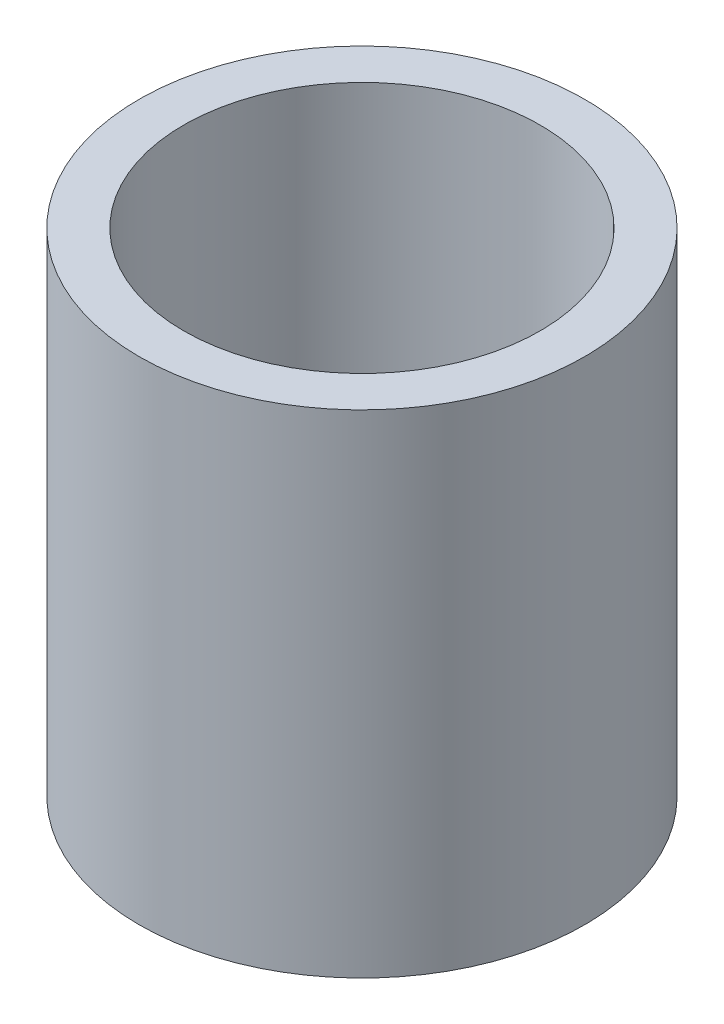
ISO-10303-21;
HEADER;
FILE_DESCRIPTION(('STEP AP214'),'2;1');
FILE_NAME('part.step','',(''),(''),'','','');
FILE_SCHEMA(('AUTOMOTIVE_DESIGN { 1 0 10303 214 1 1 1 1 }'));
ENDSEC;
DATA;
#1=APPLICATION_CONTEXT('core data for automotive mechanical design processes');
#2=APPLICATION_PROTOCOL_DEFINITION('international standard','automotive_design',2000,#1);
#3=PRODUCT_CONTEXT('',#1,'mechanical');
#4=PRODUCT('Part','Part','',(#3));
#5=PRODUCT_RELATED_PRODUCT_CATEGORY('part','',(#4));
#6=PRODUCT_DEFINITION_FORMATION('','',#4);
#7=PRODUCT_DEFINITION_CONTEXT('part definition',#1,'design');
#8=PRODUCT_DEFINITION('design','',#6,#7);
#9=PRODUCT_DEFINITION_SHAPE('','',#8);
#10=(LENGTH_UNIT() NAMED_UNIT(*) SI_UNIT(.MILLI.,.METRE.));
#11=(NAMED_UNIT(*) PLANE_ANGLE_UNIT() SI_UNIT($,.RADIAN.));
#12=(NAMED_UNIT(*) SI_UNIT($,.STERADIAN.) SOLID_ANGLE_UNIT());
#13=UNCERTAINTY_MEASURE_WITH_UNIT(LENGTH_MEASURE(1.E-05),#10,'distance_accuracy_value','');
#14=(GEOMETRIC_REPRESENTATION_CONTEXT(3) GLOBAL_UNCERTAINTY_ASSIGNED_CONTEXT((#13)) GLOBAL_UNIT_ASSIGNED_CONTEXT((#10,
#11,#12)) REPRESENTATION_CONTEXT('',''));
#15=CARTESIAN_POINT('',(0.,0.,0.));
#16=DIRECTION('',(0.,0.,1.));
#17=DIRECTION('',(1.,0.,0.));
#18=AXIS2_PLACEMENT_3D('',#15,#16,#17);
#19=CARTESIAN_POINT('',(0.,0.69,0.));
#20=DIRECTION('',(0.,1.,0.));
#21=DIRECTION('',(0.,0.,1.));
#22=AXIS2_PLACEMENT_3D('',#19,#20,#21);
#23=PLANE('',#22);
#24=CARTESIAN_POINT('',(0.,0.69,0.));
#25=DIRECTION('',(0.,1.,0.));
#26=DIRECTION('',(0.,0.,1.));
#27=AXIS2_PLACEMENT_3D('',#24,#25,#26);
#28=CIRCLE('',#27,0.625);
#29=CARTESIAN_POINT('',(0.,0.69,0.625));
#30=VERTEX_POINT('',#29);
#31=EDGE_CURVE('E10',#30,#30,#28,.T.);
#32=ORIENTED_EDGE('',*,*,#31,.T.);
#33=EDGE_LOOP('',(#32));
#34=FACE_BOUND('',#33,.T.);
#35=CARTESIAN_POINT('',(0.,0.69,0.));
#36=DIRECTION('',(0.,1.,0.));
#37=DIRECTION('',(0.,0.,1.));
#38=AXIS2_PLACEMENT_3D('',#35,#36,#37);
#39=CIRCLE('',#38,0.5);
#40=CARTESIAN_POINT('',(0.,0.69,0.5));
#41=VERTEX_POINT('',#40);
#42=EDGE_CURVE('E46',#41,#41,#39,.T.);
#43=ORIENTED_EDGE('',*,*,#42,.F.);
#44=EDGE_LOOP('',(#43));
#45=FACE_BOUND('',#44,.T.);
#46=ADVANCED_FACE('F35',(#34,#45),#23,.T.);
#47=CARTESIAN_POINT('',(0.,-0.69,0.));
#48=DIRECTION('',(0.,1.,0.));
#49=DIRECTION('',(0.,0.,1.));
#50=AXIS2_PLACEMENT_3D('',#47,#48,#49);
#51=PLANE('',#50);
#52=CARTESIAN_POINT('',(0.,-0.69,0.));
#53=DIRECTION('',(0.,1.,0.));
#54=DIRECTION('',(0.,0.,1.));
#55=AXIS2_PLACEMENT_3D('',#52,#53,#54);
#56=CIRCLE('',#55,0.625);
#57=CARTESIAN_POINT('',(0.,-0.69,0.625));
#58=VERTEX_POINT('',#57);
#59=EDGE_CURVE('E39',#58,#58,#56,.T.);
#60=ORIENTED_EDGE('',*,*,#59,.F.);
#61=EDGE_LOOP('',(#60));
#62=FACE_BOUND('',#61,.T.);
#63=CARTESIAN_POINT('',(0.,-0.69,0.));
#64=DIRECTION('',(0.,1.,0.));
#65=DIRECTION('',(0.,0.,1.));
#66=AXIS2_PLACEMENT_3D('',#63,#64,#65);
#67=CIRCLE('',#66,0.5);
#68=CARTESIAN_POINT('',(0.,-0.69,0.5));
#69=VERTEX_POINT('',#68);
#70=EDGE_CURVE('E48',#69,#69,#67,.T.);
#71=ORIENTED_EDGE('',*,*,#70,.T.);
#72=EDGE_LOOP('',(#71));
#73=FACE_BOUND('',#72,.T.);
#74=ADVANCED_FACE('F58',(#62,#73),#51,.F.);
#75=CARTESIAN_POINT('',(0.,0.69,0.));
#76=DIRECTION('',(0.,-1.,0.));
#77=DIRECTION('',(0.,0.,-1.));
#78=AXIS2_PLACEMENT_3D('',#75,#76,#77);
#79=CYLINDRICAL_SURFACE('',#78,0.625);
#80=ORIENTED_EDGE('',*,*,#31,.F.);
#81=EDGE_LOOP('',(#80));
#82=FACE_BOUND('',#81,.T.);
#83=ORIENTED_EDGE('',*,*,#59,.T.);
#84=EDGE_LOOP('',(#83));
#85=FACE_BOUND('',#84,.T.);
#86=ADVANCED_FACE('F37',(#82,#85),#79,.T.);
#87=CARTESIAN_POINT('',(0.,0.69,0.));
#88=DIRECTION('',(0.,-1.,0.));
#89=DIRECTION('',(0.,0.,-1.));
#90=AXIS2_PLACEMENT_3D('',#87,#88,#89);
#91=CYLINDRICAL_SURFACE('',#90,0.5);
#92=ORIENTED_EDGE('',*,*,#42,.T.);
#93=EDGE_LOOP('',(#92));
#94=FACE_BOUND('',#93,.T.);
#95=ORIENTED_EDGE('',*,*,#70,.F.);
#96=EDGE_LOOP('',(#95));
#97=FACE_BOUND('',#96,.T.);
#98=ADVANCED_FACE('F54',(#94,#97),#91,.F.);
#99=CLOSED_SHELL('',(#46,#74,#86,#98));
#100=MANIFOLD_SOLID_BREP('B2',#99);
#101=ADVANCED_BREP_SHAPE_REPRESENTATION('',(#18,#100),#14);
#102=SHAPE_DEFINITION_REPRESENTATION(#9,#101);
ENDSEC;
END-ISO-10303-21;
